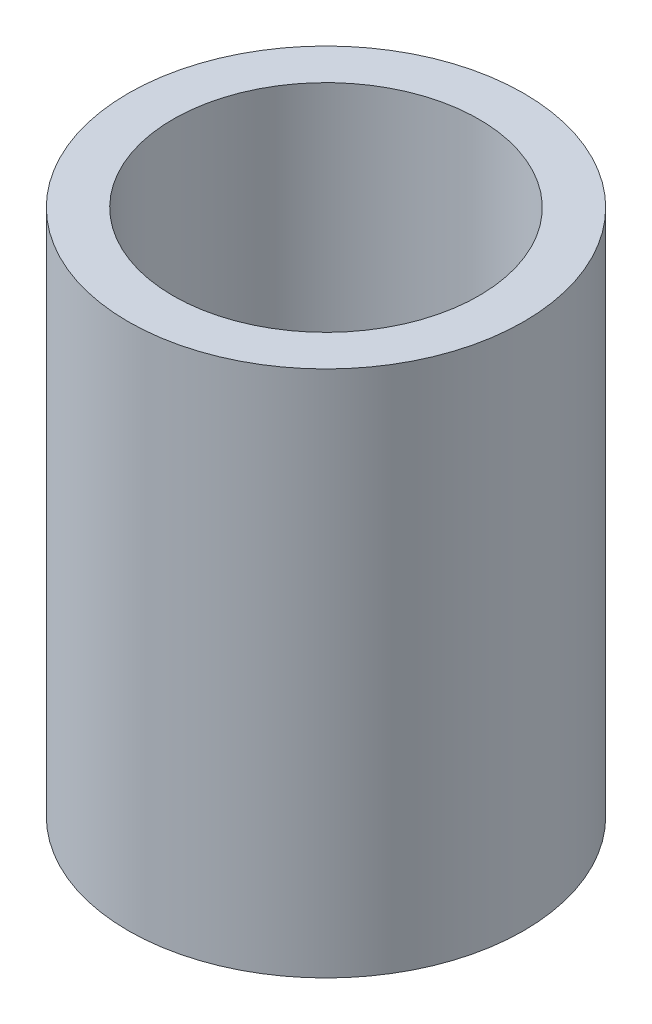
ISO-10303-21;
HEADER;
FILE_DESCRIPTION(('STEP AP214'),'2;1');
FILE_NAME('part.step','',(''),(''),'','','');
FILE_SCHEMA(('AUTOMOTIVE_DESIGN { 1 0 10303 214 1 1 1 1 }'));
ENDSEC;
DATA;
#1=APPLICATION_CONTEXT('core data for automotive mechanical design processes');
#2=APPLICATION_PROTOCOL_DEFINITION('international standard','automotive_design',2000,#1);
#3=PRODUCT_CONTEXT('',#1,'mechanical');
#4=PRODUCT('Part','Part','',(#3));
#5=PRODUCT_RELATED_PRODUCT_CATEGORY('part','',(#4));
#6=PRODUCT_DEFINITION_FORMATION('','',#4);
#7=PRODUCT_DEFINITION_CONTEXT('part definition',#1,'design');
#8=PRODUCT_DEFINITION('design','',#6,#7);
#9=PRODUCT_DEFINITION_SHAPE('','',#8);
#10=(LENGTH_UNIT() NAMED_UNIT(*) SI_UNIT(.MILLI.,.METRE.));
#11=(NAMED_UNIT(*) PLANE_ANGLE_UNIT() SI_UNIT($,.RADIAN.));
#12=(NAMED_UNIT(*) SI_UNIT($,.STERADIAN.) SOLID_ANGLE_UNIT());
#13=UNCERTAINTY_MEASURE_WITH_UNIT(LENGTH_MEASURE(1.E-05),#10,'distance_accuracy_value','');
#14=(GEOMETRIC_REPRESENTATION_CONTEXT(3) GLOBAL_UNCERTAINTY_ASSIGNED_CONTEXT((#13)) GLOBAL_UNIT_ASSIGNED_CONTEXT((#10,
#11,#12)) REPRESENTATION_CONTEXT('',''));
#15=CARTESIAN_POINT('',(0.,0.,0.));
#16=DIRECTION('',(0.,0.,1.));
#17=DIRECTION('',(1.,0.,0.));
#18=AXIS2_PLACEMENT_3D('',#15,#16,#17);
#19=CARTESIAN_POINT('',(0.,5.08,0.));
#20=DIRECTION('',(0.,-1.,0.));
#21=DIRECTION('',(0.,0.,-1.));
#22=AXIS2_PLACEMENT_3D('',#19,#20,#21);
#23=CYLINDRICAL_SURFACE('',#22,1.905);
#24=CARTESIAN_POINT('',(0.,5.08,0.));
#25=DIRECTION('',(0.,1.,0.));
#26=DIRECTION('',(0.,0.,1.));
#27=AXIS2_PLACEMENT_3D('',#24,#25,#26);
#28=CIRCLE('',#27,1.905);
#29=CARTESIAN_POINT('',(0.,5.08,1.905));
#30=VERTEX_POINT('',#29);
#31=EDGE_CURVE('E10',#30,#30,#28,.T.);
#32=ORIENTED_EDGE('',*,*,#31,.F.);
#33=EDGE_LOOP('',(#32));
#34=FACE_BOUND('',#33,.T.);
#35=CARTESIAN_POINT('',(0.,0.,0.));
#36=DIRECTION('',(0.,1.,0.));
#37=DIRECTION('',(0.,0.,1.));
#38=AXIS2_PLACEMENT_3D('',#35,#36,#37);
#39=CIRCLE('',#38,1.905);
#40=CARTESIAN_POINT('',(0.,0.,1.905));
#41=VERTEX_POINT('',#40);
#42=EDGE_CURVE('E33',#41,#41,#39,.T.);
#43=ORIENTED_EDGE('',*,*,#42,.T.);
#44=EDGE_LOOP('',(#43));
#45=FACE_BOUND('',#44,.T.);
#46=ADVANCED_FACE('F30',(#34,#45),#23,.T.);
#47=CARTESIAN_POINT('',(0.,5.08,0.));
#48=DIRECTION('',(0.,1.,0.));
#49=DIRECTION('',(0.,0.,1.));
#50=AXIS2_PLACEMENT_3D('',#47,#48,#49);
#51=PLANE('',#50);
#52=CARTESIAN_POINT('',(0.,5.08,0.));
#53=DIRECTION('',(0.,1.,0.));
#54=DIRECTION('',(0.,0.,1.));
#55=AXIS2_PLACEMENT_3D('',#52,#53,#54);
#56=CIRCLE('',#55,1.47319999999999);
#57=CARTESIAN_POINT('',(0.,5.08,1.47319999999999));
#58=VERTEX_POINT('',#57);
#59=EDGE_CURVE('E44',#58,#58,#56,.T.);
#60=ORIENTED_EDGE('',*,*,#59,.F.);
#61=EDGE_LOOP('',(#60));
#62=FACE_BOUND('',#61,.T.);
#63=ORIENTED_EDGE('',*,*,#31,.T.);
#64=EDGE_LOOP('',(#63));
#65=FACE_BOUND('',#64,.T.);
#66=ADVANCED_FACE('F50',(#62,#65),#51,.T.);
#67=CARTESIAN_POINT('',(0.,0.,0.));
#68=DIRECTION('',(0.,1.,0.));
#69=DIRECTION('',(0.,0.,1.));
#70=AXIS2_PLACEMENT_3D('',#67,#68,#69);
#71=PLANE('',#70);
#72=CARTESIAN_POINT('',(0.,0.,0.));
#73=DIRECTION('',(0.,1.,0.));
#74=DIRECTION('',(0.,0.,1.));
#75=AXIS2_PLACEMENT_3D('',#72,#73,#74);
#76=CIRCLE('',#75,1.47319999999997);
#77=CARTESIAN_POINT('',(0.,0.,1.47319999999997));
#78=VERTEX_POINT('',#77);
#79=EDGE_CURVE('E40',#78,#78,#76,.T.);
#80=ORIENTED_EDGE('',*,*,#79,.T.);
#81=EDGE_LOOP('',(#80));
#82=FACE_BOUND('',#81,.T.);
#83=ORIENTED_EDGE('',*,*,#42,.F.);
#84=EDGE_LOOP('',(#83));
#85=FACE_BOUND('',#84,.T.);
#86=ADVANCED_FACE('F52',(#82,#85),#71,.F.);
#87=CARTESIAN_POINT('',(0.,5.08,0.));
#88=DIRECTION('',(0.,1.,0.));
#89=DIRECTION('',(0.,0.,1.));
#90=AXIS2_PLACEMENT_3D('',#87,#88,#89);
#91=CYLINDRICAL_SURFACE('',#90,1.47319999999998);
#92=ORIENTED_EDGE('',*,*,#79,.F.);
#93=EDGE_LOOP('',(#92));
#94=FACE_BOUND('',#93,.T.);
#95=ORIENTED_EDGE('',*,*,#59,.T.);
#96=EDGE_LOOP('',(#95));
#97=FACE_BOUND('',#96,.T.);
#98=ADVANCED_FACE('F48',(#94,#97),#91,.F.);
#99=CLOSED_SHELL('',(#46,#66,#86,#98));
#100=MANIFOLD_SOLID_BREP('B2',#99);
#101=ADVANCED_BREP_SHAPE_REPRESENTATION('',(#18,#100),#14);
#102=SHAPE_DEFINITION_REPRESENTATION(#9,#101);
ENDSEC;
END-ISO-10303-21;
